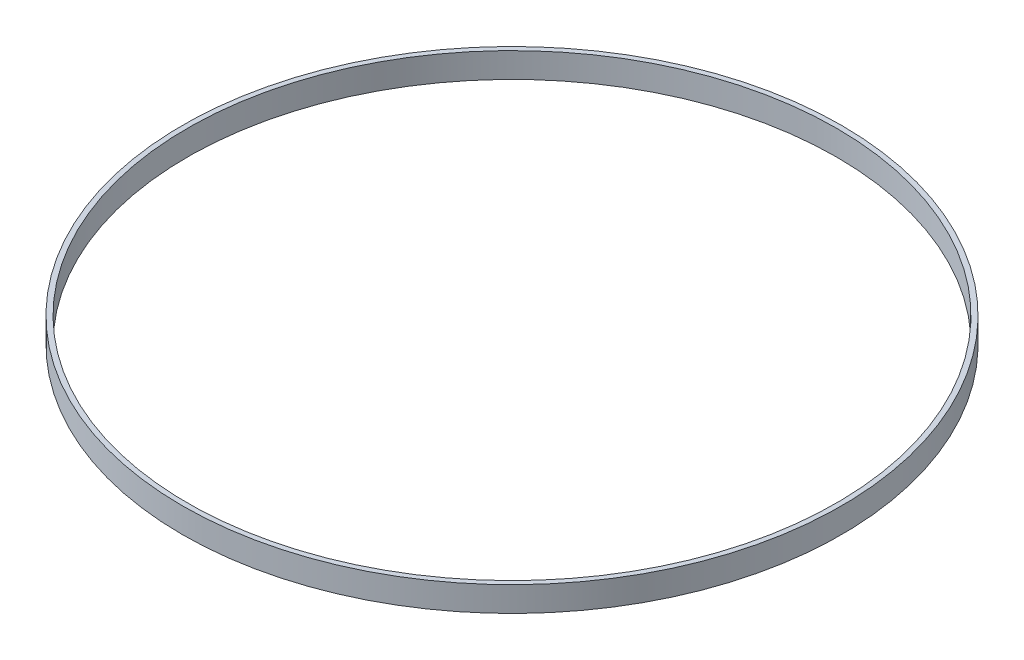
ISO-10303-21;
HEADER;
FILE_DESCRIPTION(('STEP AP214'),'2;1');
FILE_NAME('part.step','',(''),(''),'','','');
FILE_SCHEMA(('AUTOMOTIVE_DESIGN { 1 0 10303 214 1 1 1 1 }'));
ENDSEC;
DATA;
#1=APPLICATION_CONTEXT('core data for automotive mechanical design processes');
#2=APPLICATION_PROTOCOL_DEFINITION('international standard','automotive_design',2000,#1);
#3=PRODUCT_CONTEXT('',#1,'mechanical');
#4=PRODUCT('Part','Part','',(#3));
#5=PRODUCT_RELATED_PRODUCT_CATEGORY('part','',(#4));
#6=PRODUCT_DEFINITION_FORMATION('','',#4);
#7=PRODUCT_DEFINITION_CONTEXT('part definition',#1,'design');
#8=PRODUCT_DEFINITION('design','',#6,#7);
#9=PRODUCT_DEFINITION_SHAPE('','',#8);
#10=(LENGTH_UNIT() NAMED_UNIT(*) SI_UNIT(.MILLI.,.METRE.));
#11=(NAMED_UNIT(*) PLANE_ANGLE_UNIT() SI_UNIT($,.RADIAN.));
#12=(NAMED_UNIT(*) SI_UNIT($,.STERADIAN.) SOLID_ANGLE_UNIT());
#13=UNCERTAINTY_MEASURE_WITH_UNIT(LENGTH_MEASURE(1.E-05),#10,'distance_accuracy_value','');
#14=(GEOMETRIC_REPRESENTATION_CONTEXT(3) GLOBAL_UNCERTAINTY_ASSIGNED_CONTEXT((#13)) GLOBAL_UNIT_ASSIGNED_CONTEXT((#10,
#11,#12)) REPRESENTATION_CONTEXT('',''));
#15=CARTESIAN_POINT('',(0.,0.,0.));
#16=DIRECTION('',(0.,0.,1.));
#17=DIRECTION('',(1.,0.,0.));
#18=AXIS2_PLACEMENT_3D('',#15,#16,#17);
#19=CARTESIAN_POINT('',(132.,10.,0.));
#20=DIRECTION('',(0.,1.,0.));
#21=DIRECTION('',(0.,0.,1.));
#22=AXIS2_PLACEMENT_3D('',#19,#20,#21);
#23=PLANE('',#22);
#24=CARTESIAN_POINT('',(0.,10.,0.));
#25=DIRECTION('',(0.,-1.,0.));
#26=DIRECTION('',(0.,0.,-1.));
#27=AXIS2_PLACEMENT_3D('',#24,#25,#26);
#28=CIRCLE('',#27,130.);
#29=CARTESIAN_POINT('',(0.,10.,-130.));
#30=VERTEX_POINT('',#29);
#31=EDGE_CURVE('E10',#30,#30,#28,.T.);
#32=ORIENTED_EDGE('',*,*,#31,.T.);
#33=EDGE_LOOP('',(#32));
#34=FACE_BOUND('',#33,.T.);
#35=CARTESIAN_POINT('',(0.,10.,0.));
#36=DIRECTION('',(0.,-1.,0.));
#37=DIRECTION('',(0.,0.,-1.));
#38=AXIS2_PLACEMENT_3D('',#35,#36,#37);
#39=CIRCLE('',#38,132.);
#40=CARTESIAN_POINT('',(0.,10.,-132.));
#41=VERTEX_POINT('',#40);
#42=EDGE_CURVE('E44',#41,#41,#39,.T.);
#43=ORIENTED_EDGE('',*,*,#42,.F.);
#44=EDGE_LOOP('',(#43));
#45=FACE_BOUND('',#44,.T.);
#46=ADVANCED_FACE('F30',(#34,#45),#23,.T.);
#47=CARTESIAN_POINT('',(0.,0.,0.));
#48=DIRECTION('',(0.,-1.,0.));
#49=DIRECTION('',(0.,0.,-1.));
#50=AXIS2_PLACEMENT_3D('',#47,#48,#49);
#51=CYLINDRICAL_SURFACE('',#50,130.);
#52=CARTESIAN_POINT('',(0.,0.,0.));
#53=DIRECTION('',(0.,-1.,0.));
#54=DIRECTION('',(0.,0.,-1.));
#55=AXIS2_PLACEMENT_3D('',#52,#53,#54);
#56=CIRCLE('',#55,130.);
#57=CARTESIAN_POINT('',(0.,0.,-130.));
#58=VERTEX_POINT('',#57);
#59=EDGE_CURVE('E36',#58,#58,#56,.T.);
#60=ORIENTED_EDGE('',*,*,#59,.T.);
#61=EDGE_LOOP('',(#60));
#62=FACE_BOUND('',#61,.T.);
#63=ORIENTED_EDGE('',*,*,#31,.F.);
#64=EDGE_LOOP('',(#63));
#65=FACE_BOUND('',#64,.T.);
#66=ADVANCED_FACE('F54',(#62,#65),#51,.F.);
#67=CARTESIAN_POINT('',(130.,0.,0.));
#68=DIRECTION('',(0.,-1.,0.));
#69=DIRECTION('',(0.,0.,-1.));
#70=AXIS2_PLACEMENT_3D('',#67,#68,#69);
#71=PLANE('',#70);
#72=CARTESIAN_POINT('',(0.,0.,0.));
#73=DIRECTION('',(0.,-1.,0.));
#74=DIRECTION('',(0.,0.,-1.));
#75=AXIS2_PLACEMENT_3D('',#72,#73,#74);
#76=CIRCLE('',#75,132.);
#77=CARTESIAN_POINT('',(0.,0.,-132.));
#78=VERTEX_POINT('',#77);
#79=EDGE_CURVE('E40',#78,#78,#76,.T.);
#80=ORIENTED_EDGE('',*,*,#79,.T.);
#81=EDGE_LOOP('',(#80));
#82=FACE_BOUND('',#81,.T.);
#83=ORIENTED_EDGE('',*,*,#59,.F.);
#84=EDGE_LOOP('',(#83));
#85=FACE_BOUND('',#84,.T.);
#86=ADVANCED_FACE('F58',(#82,#85),#71,.T.);
#87=CARTESIAN_POINT('',(0.,0.,0.));
#88=DIRECTION('',(0.,-1.,0.));
#89=DIRECTION('',(0.,0.,-1.));
#90=AXIS2_PLACEMENT_3D('',#87,#88,#89);
#91=CYLINDRICAL_SURFACE('',#90,132.);
#92=ORIENTED_EDGE('',*,*,#42,.T.);
#93=EDGE_LOOP('',(#92));
#94=FACE_BOUND('',#93,.T.);
#95=ORIENTED_EDGE('',*,*,#79,.F.);
#96=EDGE_LOOP('',(#95));
#97=FACE_BOUND('',#96,.T.);
#98=ADVANCED_FACE('F50',(#94,#97),#91,.T.);
#99=CLOSED_SHELL('',(#46,#66,#86,#98));
#100=MANIFOLD_SOLID_BREP('B2',#99);
#101=ADVANCED_BREP_SHAPE_REPRESENTATION('',(#18,#100),#14);
#102=SHAPE_DEFINITION_REPRESENTATION(#9,#101);
ENDSEC;
END-ISO-10303-21;
